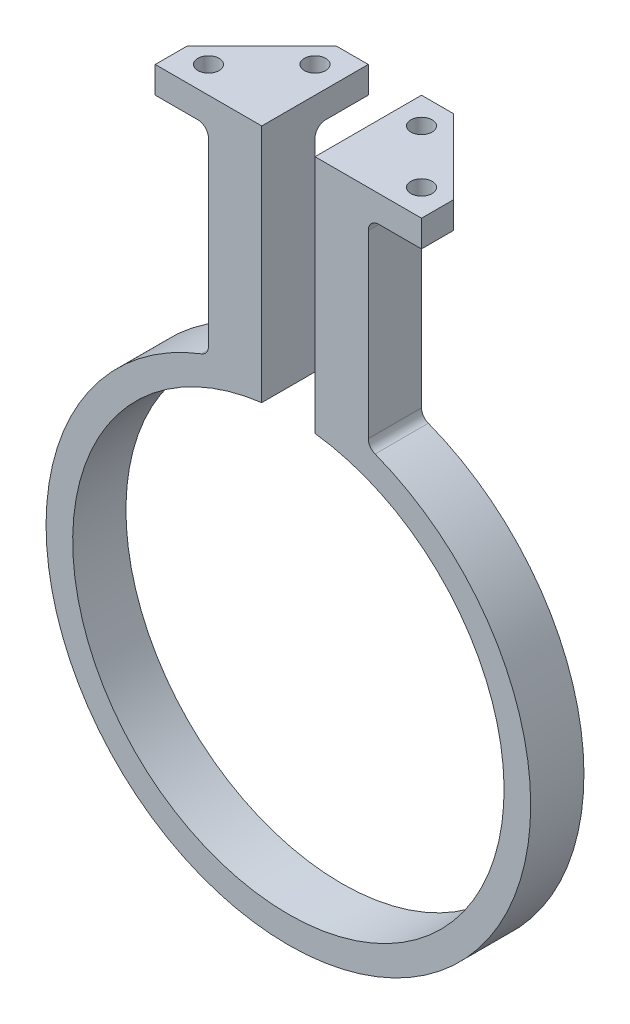
ISO-10303-21;
HEADER;
FILE_DESCRIPTION(('STEP AP214'),'2;1');
FILE_NAME('part.step','',(''),(''),'','','');
FILE_SCHEMA(('AUTOMOTIVE_DESIGN { 1 0 10303 214 1 1 1 1 }'));
ENDSEC;
DATA;
#1=APPLICATION_CONTEXT('core data for automotive mechanical design processes');
#2=APPLICATION_PROTOCOL_DEFINITION('international standard','automotive_design',2000,#1);
#3=PRODUCT_CONTEXT('',#1,'mechanical');
#4=PRODUCT('Part','Part','',(#3));
#5=PRODUCT_RELATED_PRODUCT_CATEGORY('part','',(#4));
#6=PRODUCT_DEFINITION_FORMATION('','',#4);
#7=PRODUCT_DEFINITION_CONTEXT('part definition',#1,'design');
#8=PRODUCT_DEFINITION('design','',#6,#7);
#9=PRODUCT_DEFINITION_SHAPE('','',#8);
#10=(LENGTH_UNIT() NAMED_UNIT(*) SI_UNIT(.MILLI.,.METRE.));
#11=(NAMED_UNIT(*) PLANE_ANGLE_UNIT() SI_UNIT($,.RADIAN.));
#12=(NAMED_UNIT(*) SI_UNIT($,.STERADIAN.) SOLID_ANGLE_UNIT());
#13=UNCERTAINTY_MEASURE_WITH_UNIT(LENGTH_MEASURE(1.E-05),#10,'distance_accuracy_value','');
#14=(GEOMETRIC_REPRESENTATION_CONTEXT(3) GLOBAL_UNCERTAINTY_ASSIGNED_CONTEXT((#13)) GLOBAL_UNIT_ASSIGNED_CONTEXT((#10,
#11,#12)) REPRESENTATION_CONTEXT('',''));
#15=CARTESIAN_POINT('',(0.,0.,0.));
#16=DIRECTION('',(0.,0.,1.));
#17=DIRECTION('',(1.,0.,0.));
#18=AXIS2_PLACEMENT_3D('',#15,#16,#17);
#19=CARTESIAN_POINT('',(0.,0.,12.7));
#20=DIRECTION('',(0.,0.,-1.));
#21=DIRECTION('',(-1.,0.,0.));
#22=AXIS2_PLACEMENT_3D('',#19,#20,#21);
#23=CYLINDRICAL_SURFACE('',#22,57.785);
#24=CARTESIAN_POINT('',(0.,0.,0.));
#25=DIRECTION('',(0.,0.,1.));
#26=DIRECTION('',(1.,0.,0.));
#27=AXIS2_PLACEMENT_3D('',#24,#25,#26);
#28=CIRCLE('',#27,57.785);
#29=CARTESIAN_POINT('',(-20.680947368421,53.9574336022813,0.));
#30=VERTEX_POINT('',#29);
#31=CARTESIAN_POINT('',(20.680947368421,53.9574336022813,0.));
#32=VERTEX_POINT('',#31);
#33=EDGE_CURVE('E289',#30,#32,#28,.T.);
#34=ORIENTED_EDGE('',*,*,#33,.T.);
#35=DIRECTION('',(0.,0.,-1.));
#36=VECTOR('',#35,1.);
#37=CARTESIAN_POINT('',(20.6809473684211,53.9574336022813,12.7));
#38=LINE('',#37,#36);
#39=CARTESIAN_POINT('',(20.680947368421,53.9574336022813,12.7));
#40=VERTEX_POINT('',#39);
#41=EDGE_CURVE('E404',#32,#40,#38,.F.);
#42=ORIENTED_EDGE('',*,*,#41,.T.);
#43=CARTESIAN_POINT('',(0.,0.,12.7));
#44=DIRECTION('',(0.,0.,1.));
#45=DIRECTION('',(1.,0.,0.));
#46=AXIS2_PLACEMENT_3D('',#43,#44,#45);
#47=CIRCLE('',#46,57.785);
#48=CARTESIAN_POINT('',(-20.680947368421,53.9574336022813,12.7));
#49=VERTEX_POINT('',#48);
#50=EDGE_CURVE('E290',#49,#40,#47,.T.);
#51=ORIENTED_EDGE('',*,*,#50,.F.);
#52=DIRECTION('',(0.,0.,-1.));
#53=VECTOR('',#52,1.);
#54=CARTESIAN_POINT('',(-20.6809473684211,53.9574336022813,12.7));
#55=LINE('',#54,#53);
#56=EDGE_CURVE('E400',#49,#30,#55,.T.);
#57=ORIENTED_EDGE('',*,*,#56,.T.);
#58=EDGE_LOOP('',(#34,#42,#51,#57));
#59=FACE_BOUND('',#58,.T.);
#60=ADVANCED_FACE('F41',(#59),#23,.T.);
#61=CARTESIAN_POINT('',(19.05,54.554593986208,12.7));
#62=DIRECTION('',(-1.,0.,0.));
#63=DIRECTION('',(0.,0.,1.));
#64=AXIS2_PLACEMENT_3D('',#61,#62,#63);
#65=PLANE('',#64);
#66=DIRECTION('',(0.,1.,0.));
#67=VECTOR('',#66,1.);
#68=CARTESIAN_POINT('',(19.05,54.554593986208,12.7));
#69=LINE('',#68,#67);
#70=CARTESIAN_POINT('',(19.05,56.3291889254585,12.7));
#71=VERTEX_POINT('',#70);
#72=CARTESIAN_POINT('',(19.05,99.3015196188358,12.7));
#73=VERTEX_POINT('',#72);
#74=EDGE_CURVE('E294',#71,#73,#69,.T.);
#75=ORIENTED_EDGE('',*,*,#74,.F.);
#76=DIRECTION('',(0.,0.,1.));
#77=VECTOR('',#76,1.);
#78=CARTESIAN_POINT('',(19.05,56.3291889254585,0.));
#79=LINE('',#78,#77);
#80=CARTESIAN_POINT('',(19.05,56.3291889254585,0.));
#81=VERTEX_POINT('',#80);
#82=EDGE_CURVE('E396',#71,#81,#79,.F.);
#83=ORIENTED_EDGE('',*,*,#82,.T.);
#84=DIRECTION('',(0.,1.,0.));
#85=VECTOR('',#84,1.);
#86=CARTESIAN_POINT('',(19.05,54.554593986208,0.));
#87=LINE('',#86,#85);
#88=CARTESIAN_POINT('',(19.05,99.3015196188358,0.));
#89=VERTEX_POINT('',#88);
#90=EDGE_CURVE('E315',#81,#89,#87,.T.);
#91=ORIENTED_EDGE('',*,*,#90,.T.);
#92=DIRECTION('',(0.,0.,-1.));
#93=VECTOR('',#92,1.);
#94=CARTESIAN_POINT('',(19.05,99.3015196188358,12.7));
#95=LINE('',#94,#93);
#96=EDGE_CURVE('E393',#89,#73,#95,.F.);
#97=ORIENTED_EDGE('',*,*,#96,.T.);
#98=EDGE_LOOP('',(#75,#83,#91,#97));
#99=FACE_BOUND('',#98,.T.);
#100=ADVANCED_FACE('F479',(#99),#65,.F.);
#101=CARTESIAN_POINT('',(6.35,51.0415196188358,12.7));
#102=DIRECTION('',(1.,0.,0.));
#103=DIRECTION('',(0.,0.,-1.));
#104=AXIS2_PLACEMENT_3D('',#101,#102,#103);
#105=PLANE('',#104);
#106=DIRECTION('',(0.,0.,-1.));
#107=VECTOR('',#106,1.);
#108=CARTESIAN_POINT('',(6.35,101.841519618836,-12.7));
#109=LINE('',#108,#107);
#110=CARTESIAN_POINT('',(6.35,101.841519618836,-2.54));
#111=VERTEX_POINT('',#110);
#112=CARTESIAN_POINT('',(6.35,101.841519618836,-12.7));
#113=VERTEX_POINT('',#112);
#114=EDGE_CURVE('E236',#111,#113,#109,.T.);
#115=ORIENTED_EDGE('',*,*,#114,.F.);
#116=CARTESIAN_POINT('',(6.35,99.3015196188358,-2.54));
#117=DIRECTION('',(1.,0.,0.));
#118=DIRECTION('',(0.,0.,-1.));
#119=AXIS2_PLACEMENT_3D('',#116,#117,#118);
#120=CIRCLE('',#119,2.54);
#121=CARTESIAN_POINT('',(6.35,99.3015196188358,0.));
#122=VERTEX_POINT('',#121);
#123=EDGE_CURVE('E51',#111,#122,#120,.T.);
#124=ORIENTED_EDGE('',*,*,#123,.T.);
#125=DIRECTION('',(0.,-1.,0.));
#126=VECTOR('',#125,1.);
#127=CARTESIAN_POINT('',(6.35,51.0415196188358,0.));
#128=LINE('',#127,#126);
#129=CARTESIAN_POINT('',(6.35000000000001,51.0415196188358,0.));
#130=VERTEX_POINT('',#129);
#131=EDGE_CURVE('E319',#122,#130,#128,.T.);
#132=ORIENTED_EDGE('',*,*,#131,.T.);
#133=DIRECTION('',(0.,0.,-1.));
#134=VECTOR('',#133,1.);
#135=CARTESIAN_POINT('',(6.35000000000001,51.0415196188358,12.7));
#136=LINE('',#135,#134);
#137=CARTESIAN_POINT('',(6.35000000000001,51.0415196188358,12.7));
#138=VERTEX_POINT('',#137);
#139=EDGE_CURVE('E335',#138,#130,#136,.T.);
#140=ORIENTED_EDGE('',*,*,#139,.F.);
#141=DIRECTION('',(0.,-1.,0.));
#142=VECTOR('',#141,1.);
#143=CARTESIAN_POINT('',(6.35,51.0415196188358,12.7));
#144=LINE('',#143,#142);
#145=CARTESIAN_POINT('',(6.35,108.191519618836,12.7));
#146=VERTEX_POINT('',#145);
#147=EDGE_CURVE('E222',#146,#138,#144,.T.);
#148=ORIENTED_EDGE('',*,*,#147,.F.);
#149=DIRECTION('',(0.,0.,-1.));
#150=VECTOR('',#149,1.);
#151=CARTESIAN_POINT('',(6.35,108.191519618836,-12.7));
#152=LINE('',#151,#150);
#153=CARTESIAN_POINT('',(6.35,108.191519618836,-12.7));
#154=VERTEX_POINT('',#153);
#155=EDGE_CURVE('E213',#146,#154,#152,.T.);
#156=ORIENTED_EDGE('',*,*,#155,.T.);
#157=DIRECTION('',(0.,-1.,0.));
#158=VECTOR('',#157,1.);
#159=CARTESIAN_POINT('',(6.35,108.191519618836,-12.7));
#160=LINE('',#159,#158);
#161=EDGE_CURVE('E194',#154,#113,#160,.T.);
#162=ORIENTED_EDGE('',*,*,#161,.T.);
#163=EDGE_LOOP('',(#115,#124,#132,#140,#148,#156,#162));
#164=FACE_BOUND('',#163,.T.);
#165=ADVANCED_FACE('F220',(#164),#105,.F.);
#166=CARTESIAN_POINT('',(0.,0.,12.7));
#167=DIRECTION('',(0.,0.,-1.));
#168=DIRECTION('',(-1.,0.,0.));
#169=AXIS2_PLACEMENT_3D('',#166,#167,#168);
#170=CYLINDRICAL_SURFACE('',#169,51.435);
#171=CARTESIAN_POINT('',(0.,0.,0.));
#172=DIRECTION('',(0.,0.,-1.));
#173=DIRECTION('',(1.,0.,0.));
#174=AXIS2_PLACEMENT_3D('',#171,#172,#173);
#175=CIRCLE('',#174,51.435);
#176=CARTESIAN_POINT('',(-6.35,51.0415196188358,0.));
#177=VERTEX_POINT('',#176);
#178=EDGE_CURVE('E322',#130,#177,#175,.T.);
#179=ORIENTED_EDGE('',*,*,#178,.T.);
#180=DIRECTION('',(0.,0.,-1.));
#181=VECTOR('',#180,1.);
#182=CARTESIAN_POINT('',(-6.35,51.0415196188358,12.7));
#183=LINE('',#182,#181);
#184=CARTESIAN_POINT('',(-6.35,51.0415196188358,12.7));
#185=VERTEX_POINT('',#184);
#186=EDGE_CURVE('E311',#185,#177,#183,.T.);
#187=ORIENTED_EDGE('',*,*,#186,.F.);
#188=CARTESIAN_POINT('',(0.,0.,12.7));
#189=DIRECTION('',(0.,0.,-1.));
#190=DIRECTION('',(1.,0.,0.));
#191=AXIS2_PLACEMENT_3D('',#188,#189,#190);
#192=CIRCLE('',#191,51.435);
#193=EDGE_CURVE('E301',#138,#185,#192,.T.);
#194=ORIENTED_EDGE('',*,*,#193,.F.);
#195=ORIENTED_EDGE('',*,*,#139,.T.);
#196=EDGE_LOOP('',(#179,#187,#194,#195));
#197=FACE_BOUND('',#196,.T.);
#198=ADVANCED_FACE('F499',(#197),#170,.F.);
#199=CARTESIAN_POINT('',(-6.35,51.0415196188358,12.7));
#200=DIRECTION('',(-1.,0.,0.));
#201=DIRECTION('',(0.,0.,1.));
#202=AXIS2_PLACEMENT_3D('',#199,#200,#201);
#203=PLANE('',#202);
#204=DIRECTION('',(0.,1.,0.));
#205=VECTOR('',#204,1.);
#206=CARTESIAN_POINT('',(-6.35,51.0415196188358,0.));
#207=LINE('',#206,#205);
#208=CARTESIAN_POINT('',(-6.35,99.3015196188358,0.));
#209=VERTEX_POINT('',#208);
#210=EDGE_CURVE('E325',#177,#209,#207,.T.);
#211=ORIENTED_EDGE('',*,*,#210,.T.);
#212=CARTESIAN_POINT('',(-6.35,99.3015196188358,-2.54));
#213=DIRECTION('',(-1.,0.,0.));
#214=DIRECTION('',(0.,0.,1.));
#215=AXIS2_PLACEMENT_3D('',#212,#213,#214);
#216=CIRCLE('',#215,2.54);
#217=CARTESIAN_POINT('',(-6.35,101.841519618836,-2.54));
#218=VERTEX_POINT('',#217);
#219=EDGE_CURVE('E451',#209,#218,#216,.T.);
#220=ORIENTED_EDGE('',*,*,#219,.T.);
#221=DIRECTION('',(0.,0.,-1.));
#222=VECTOR('',#221,1.);
#223=CARTESIAN_POINT('',(-6.35,101.841519618836,-12.7));
#224=LINE('',#223,#222);
#225=CARTESIAN_POINT('',(-6.35,101.841519618836,-12.7));
#226=VERTEX_POINT('',#225);
#227=EDGE_CURVE('E276',#218,#226,#224,.T.);
#228=ORIENTED_EDGE('',*,*,#227,.T.);
#229=DIRECTION('',(0.,-1.,0.));
#230=VECTOR('',#229,1.);
#231=CARTESIAN_POINT('',(-6.35,108.191519618836,-12.7));
#232=LINE('',#231,#230);
#233=CARTESIAN_POINT('',(-6.35,108.191519618836,-12.7));
#234=VERTEX_POINT('',#233);
#235=EDGE_CURVE('E269',#234,#226,#232,.T.);
#236=ORIENTED_EDGE('',*,*,#235,.F.);
#237=DIRECTION('',(0.,0.,-1.));
#238=VECTOR('',#237,1.);
#239=CARTESIAN_POINT('',(-6.35,108.191519618836,-12.7));
#240=LINE('',#239,#238);
#241=CARTESIAN_POINT('',(-6.35,108.191519618836,12.7));
#242=VERTEX_POINT('',#241);
#243=EDGE_CURVE('E262',#242,#234,#240,.T.);
#244=ORIENTED_EDGE('',*,*,#243,.F.);
#245=DIRECTION('',(0.,1.,0.));
#246=VECTOR('',#245,1.);
#247=CARTESIAN_POINT('',(-6.35,51.0415196188358,12.7));
#248=LINE('',#247,#246);
#249=EDGE_CURVE('E304',#185,#242,#248,.T.);
#250=ORIENTED_EDGE('',*,*,#249,.F.);
#251=ORIENTED_EDGE('',*,*,#186,.T.);
#252=EDGE_LOOP('',(#211,#220,#228,#236,#244,#250,#251));
#253=FACE_BOUND('',#252,.T.);
#254=ADVANCED_FACE('F688',(#253),#203,.F.);
#255=CARTESIAN_POINT('',(-19.05,54.554593986208,12.7));
#256=DIRECTION('',(1.,0.,0.));
#257=DIRECTION('',(0.,0.,-1.));
#258=AXIS2_PLACEMENT_3D('',#255,#256,#257);
#259=PLANE('',#258);
#260=DIRECTION('',(0.,-1.,0.));
#261=VECTOR('',#260,1.);
#262=CARTESIAN_POINT('',(-19.05,54.554593986208,0.));
#263=LINE('',#262,#261);
#264=CARTESIAN_POINT('',(-19.05,99.3015196188358,0.));
#265=VERTEX_POINT('',#264);
#266=CARTESIAN_POINT('',(-19.05,56.3291889254585,0.));
#267=VERTEX_POINT('',#266);
#268=EDGE_CURVE('E295',#265,#267,#263,.T.);
#269=ORIENTED_EDGE('',*,*,#268,.T.);
#270=DIRECTION('',(0.,0.,1.));
#271=VECTOR('',#270,1.);
#272=CARTESIAN_POINT('',(-19.05,56.3291889254585,12.7));
#273=LINE('',#272,#271);
#274=CARTESIAN_POINT('',(-19.05,56.3291889254585,12.7));
#275=VERTEX_POINT('',#274);
#276=EDGE_CURVE('E411',#267,#275,#273,.T.);
#277=ORIENTED_EDGE('',*,*,#276,.T.);
#278=DIRECTION('',(0.,-1.,0.));
#279=VECTOR('',#278,1.);
#280=CARTESIAN_POINT('',(-19.05,54.554593986208,12.7));
#281=LINE('',#280,#279);
#282=CARTESIAN_POINT('',(-19.05,99.3015196188358,12.7));
#283=VERTEX_POINT('',#282);
#284=EDGE_CURVE('E307',#283,#275,#281,.T.);
#285=ORIENTED_EDGE('',*,*,#284,.F.);
#286=DIRECTION('',(0.,0.,-1.));
#287=VECTOR('',#286,1.);
#288=CARTESIAN_POINT('',(-19.05,99.3015196188358,0.));
#289=LINE('',#288,#287);
#290=EDGE_CURVE('E407',#283,#265,#289,.T.);
#291=ORIENTED_EDGE('',*,*,#290,.T.);
#292=EDGE_LOOP('',(#269,#277,#285,#291));
#293=FACE_BOUND('',#292,.T.);
#294=ADVANCED_FACE('F702',(#293),#259,.F.);
#295=CARTESIAN_POINT('',(0.,0.,12.7));
#296=DIRECTION('',(0.,0.,1.));
#297=DIRECTION('',(1.,0.,0.));
#298=AXIS2_PLACEMENT_3D('',#295,#296,#297);
#299=PLANE('',#298);
#300=ORIENTED_EDGE('',*,*,#284,.T.);
#301=CARTESIAN_POINT('',(-21.59,56.3291889254585,12.7));
#302=DIRECTION('',(0.,0.,1.));
#303=DIRECTION('',(1.,0.,0.));
#304=AXIS2_PLACEMENT_3D('',#301,#302,#303);
#305=CIRCLE('',#304,2.54);
#306=EDGE_CURVE('E445',#275,#49,#305,.F.);
#307=ORIENTED_EDGE('',*,*,#306,.T.);
#308=ORIENTED_EDGE('',*,*,#50,.T.);
#309=CARTESIAN_POINT('',(21.59,56.3291889254585,12.7));
#310=DIRECTION('',(0.,0.,1.));
#311=DIRECTION('',(1.,0.,0.));
#312=AXIS2_PLACEMENT_3D('',#309,#310,#311);
#313=CIRCLE('',#312,2.54);
#314=EDGE_CURVE('E439',#40,#71,#313,.F.);
#315=ORIENTED_EDGE('',*,*,#314,.T.);
#316=ORIENTED_EDGE('',*,*,#74,.T.);
#317=CARTESIAN_POINT('',(21.59,99.3015196188358,12.7));
#318=DIRECTION('',(0.,0.,1.));
#319=DIRECTION('',(1.,0.,0.));
#320=AXIS2_PLACEMENT_3D('',#317,#318,#319);
#321=CIRCLE('',#320,2.54);
#322=CARTESIAN_POINT('',(21.59,101.841519618836,12.7));
#323=VERTEX_POINT('',#322);
#324=EDGE_CURVE('E11',#73,#323,#321,.F.);
#325=ORIENTED_EDGE('',*,*,#324,.T.);
#326=DIRECTION('',(-1.,0.,0.));
#327=VECTOR('',#326,1.);
#328=CARTESIAN_POINT('',(31.75,101.841519618836,12.7));
#329=LINE('',#328,#327);
#330=CARTESIAN_POINT('',(31.75,101.841519618836,12.7));
#331=VERTEX_POINT('',#330);
#332=EDGE_CURVE('E239',#331,#323,#329,.T.);
#333=ORIENTED_EDGE('',*,*,#332,.F.);
#334=DIRECTION('',(0.,-1.,0.));
#335=VECTOR('',#334,1.);
#336=CARTESIAN_POINT('',(31.75,108.191519618836,12.7));
#337=LINE('',#336,#335);
#338=CARTESIAN_POINT('',(31.75,108.191519618836,12.7));
#339=VERTEX_POINT('',#338);
#340=EDGE_CURVE('E206',#339,#331,#337,.T.);
#341=ORIENTED_EDGE('',*,*,#340,.F.);
#342=DIRECTION('',(-1.,0.,0.));
#343=VECTOR('',#342,1.);
#344=CARTESIAN_POINT('',(31.75,108.191519618836,12.7));
#345=LINE('',#344,#343);
#346=EDGE_CURVE('E224',#339,#146,#345,.T.);
#347=ORIENTED_EDGE('',*,*,#346,.T.);
#348=ORIENTED_EDGE('',*,*,#147,.T.);
#349=ORIENTED_EDGE('',*,*,#193,.T.);
#350=ORIENTED_EDGE('',*,*,#249,.T.);
#351=DIRECTION('',(1.,0.,0.));
#352=VECTOR('',#351,1.);
#353=CARTESIAN_POINT('',(-31.75,108.191519618836,12.7));
#354=LINE('',#353,#352);
#355=CARTESIAN_POINT('',(-31.75,108.191519618836,12.7));
#356=VERTEX_POINT('',#355);
#357=EDGE_CURVE('E257',#356,#242,#354,.T.);
#358=ORIENTED_EDGE('',*,*,#357,.F.);
#359=DIRECTION('',(0.,-1.,0.));
#360=VECTOR('',#359,1.);
#361=CARTESIAN_POINT('',(-31.75,108.191519618836,12.7));
#362=LINE('',#361,#360);
#363=CARTESIAN_POINT('',(-31.75,101.841519618836,12.7));
#364=VERTEX_POINT('',#363);
#365=EDGE_CURVE('E285',#356,#364,#362,.T.);
#366=ORIENTED_EDGE('',*,*,#365,.T.);
#367=DIRECTION('',(1.,0.,0.));
#368=VECTOR('',#367,1.);
#369=CARTESIAN_POINT('',(-31.75,101.841519618836,12.7));
#370=LINE('',#369,#368);
#371=CARTESIAN_POINT('',(-21.59,101.841519618836,12.7));
#372=VERTEX_POINT('',#371);
#373=EDGE_CURVE('E272',#364,#372,#370,.T.);
#374=ORIENTED_EDGE('',*,*,#373,.T.);
#375=CARTESIAN_POINT('',(-21.59,99.3015196188358,12.7));
#376=DIRECTION('',(0.,0.,1.));
#377=DIRECTION('',(1.,0.,0.));
#378=AXIS2_PLACEMENT_3D('',#375,#376,#377);
#379=CIRCLE('',#378,2.54);
#380=EDGE_CURVE('E448',#372,#283,#379,.F.);
#381=ORIENTED_EDGE('',*,*,#380,.T.);
#382=EDGE_LOOP('',(#300,#307,#308,#315,#316,#325,#333,#341,#347,#348,#349,#350,#358,#366,#374,#381));
#383=FACE_BOUND('',#382,.T.);
#384=ADVANCED_FACE('F483',(#383),#299,.T.);
#385=CARTESIAN_POINT('',(0.,0.,0.));
#386=DIRECTION('',(0.,0.,1.));
#387=DIRECTION('',(1.,0.,0.));
#388=AXIS2_PLACEMENT_3D('',#385,#386,#387);
#389=PLANE('',#388);
#390=ORIENTED_EDGE('',*,*,#268,.F.);
#391=DIRECTION('',(-1.,0.,0.));
#392=VECTOR('',#391,1.);
#393=CARTESIAN_POINT('',(-6.35,99.3015196188358,0.));
#394=LINE('',#393,#392);
#395=EDGE_CURVE('E423',#265,#209,#394,.F.);
#396=ORIENTED_EDGE('',*,*,#395,.T.);
#397=ORIENTED_EDGE('',*,*,#210,.F.);
#398=ORIENTED_EDGE('',*,*,#178,.F.);
#399=ORIENTED_EDGE('',*,*,#131,.F.);
#400=DIRECTION('',(-1.,0.,0.));
#401=VECTOR('',#400,1.);
#402=CARTESIAN_POINT('',(19.05,99.3015196188358,0.));
#403=LINE('',#402,#401);
#404=EDGE_CURVE('E420',#122,#89,#403,.F.);
#405=ORIENTED_EDGE('',*,*,#404,.T.);
#406=ORIENTED_EDGE('',*,*,#90,.F.);
#407=CARTESIAN_POINT('',(21.59,56.3291889254585,0.));
#408=DIRECTION('',(0.,0.,1.));
#409=DIRECTION('',(1.,0.,0.));
#410=AXIS2_PLACEMENT_3D('',#407,#408,#409);
#411=CIRCLE('',#410,2.54);
#412=EDGE_CURVE('E436',#81,#32,#411,.T.);
#413=ORIENTED_EDGE('',*,*,#412,.T.);
#414=ORIENTED_EDGE('',*,*,#33,.F.);
#415=CARTESIAN_POINT('',(-21.59,56.3291889254585,0.));
#416=DIRECTION('',(0.,0.,1.));
#417=DIRECTION('',(1.,0.,0.));
#418=AXIS2_PLACEMENT_3D('',#415,#416,#417);
#419=CIRCLE('',#418,2.54);
#420=EDGE_CURVE('E442',#30,#267,#419,.T.);
#421=ORIENTED_EDGE('',*,*,#420,.T.);
#422=EDGE_LOOP('',(#390,#396,#397,#398,#399,#405,#406,#413,#414,#421));
#423=FACE_BOUND('',#422,.T.);
#424=ADVANCED_FACE('F492',(#423),#389,.F.);
#425=CARTESIAN_POINT('',(0.,101.841519618836,0.));
#426=DIRECTION('',(0.,1.,0.));
#427=DIRECTION('',(0.,0.,1.));
#428=AXIS2_PLACEMENT_3D('',#425,#426,#427);
#429=PLANE('',#428);
#430=CARTESIAN_POINT('',(-12.7,101.841519618836,-6.35));
#431=DIRECTION('',(0.,1.,0.));
#432=DIRECTION('',(0.,0.,1.));
#433=AXIS2_PLACEMENT_3D('',#430,#431,#432);
#434=CIRCLE('',#433,3.64399415702657);
#435=CARTESIAN_POINT('',(-12.7,101.841519618836,-9.99399415702658));
#436=VERTEX_POINT('',#435);
#437=EDGE_CURVE('E343',#436,#436,#434,.T.);
#438=ORIENTED_EDGE('',*,*,#437,.T.);
#439=EDGE_LOOP('',(#438));
#440=FACE_BOUND('',#439,.T.);
#441=CARTESIAN_POINT('',(-25.4,101.841519618836,6.35));
#442=DIRECTION('',(0.,1.,0.));
#443=DIRECTION('',(0.,0.,1.));
#444=AXIS2_PLACEMENT_3D('',#441,#442,#443);
#445=CIRCLE('',#444,3.64399415702654);
#446=CARTESIAN_POINT('',(-25.4,101.841519618836,9.99399415702654));
#447=VERTEX_POINT('',#446);
#448=EDGE_CURVE('E339',#447,#447,#445,.T.);
#449=ORIENTED_EDGE('',*,*,#448,.T.);
#450=EDGE_LOOP('',(#449));
#451=FACE_BOUND('',#450,.T.);
#452=DIRECTION('',(-1.,0.,0.));
#453=VECTOR('',#452,1.);
#454=CARTESIAN_POINT('',(-19.05,101.841519618836,-2.54));
#455=LINE('',#454,#453);
#456=CARTESIAN_POINT('',(-21.59,101.841519618836,-2.54));
#457=VERTEX_POINT('',#456);
#458=EDGE_CURVE('E414',#218,#457,#455,.T.);
#459=ORIENTED_EDGE('',*,*,#458,.T.);
#460=DIRECTION('',(0.,0.,-1.));
#461=VECTOR('',#460,1.);
#462=CARTESIAN_POINT('',(-21.59,101.841519618836,12.7));
#463=LINE('',#462,#461);
#464=EDGE_CURVE('E417',#457,#372,#463,.F.);
#465=ORIENTED_EDGE('',*,*,#464,.T.);
#466=ORIENTED_EDGE('',*,*,#373,.F.);
#467=DIRECTION('',(0.,0.,1.));
#468=VECTOR('',#467,1.);
#469=CARTESIAN_POINT('',(-31.75,101.841519618836,-12.7));
#470=LINE('',#469,#468);
#471=CARTESIAN_POINT('',(-31.75,101.841519618836,5.07999999999996));
#472=VERTEX_POINT('',#471);
#473=EDGE_CURVE('E253',#472,#364,#470,.T.);
#474=ORIENTED_EDGE('',*,*,#473,.F.);
#475=DIRECTION('',(-0.707106781186549,0.,0.707106781186546));
#476=VECTOR('',#475,1.);
#477=CARTESIAN_POINT('',(-31.75,101.841519618836,5.07999999999996));
#478=LINE('',#477,#476);
#479=CARTESIAN_POINT('',(-13.97,101.841519618836,-12.7));
#480=VERTEX_POINT('',#479);
#481=EDGE_CURVE('E384',#472,#480,#478,.F.);
#482=ORIENTED_EDGE('',*,*,#481,.T.);
#483=DIRECTION('',(-1.,0.,0.));
#484=VECTOR('',#483,1.);
#485=CARTESIAN_POINT('',(-31.75,101.841519618836,-12.7));
#486=LINE('',#485,#484);
#487=EDGE_CURVE('E258',#226,#480,#486,.T.);
#488=ORIENTED_EDGE('',*,*,#487,.F.);
#489=ORIENTED_EDGE('',*,*,#227,.F.);
#490=EDGE_LOOP('',(#459,#465,#466,#474,#482,#488,#489));
#491=FACE_BOUND('',#490,.T.);
#492=ADVANCED_FACE('F723',(#440,#451,#491),#429,.F.);
#493=CARTESIAN_POINT('',(0.,108.191519618836,0.));
#494=DIRECTION('',(0.,1.,0.));
#495=DIRECTION('',(0.,0.,1.));
#496=AXIS2_PLACEMENT_3D('',#493,#494,#495);
#497=PLANE('',#496);
#498=CARTESIAN_POINT('',(-12.7,108.191519618836,-6.35));
#499=DIRECTION('',(0.,1.,0.));
#500=DIRECTION('',(0.,0.,1.));
#501=AXIS2_PLACEMENT_3D('',#498,#499,#500);
#502=CIRCLE('',#501,2.54);
#503=CARTESIAN_POINT('',(-12.7,108.191519618836,-3.81));
#504=VERTEX_POINT('',#503);
#505=EDGE_CURVE('E249',#504,#504,#502,.T.);
#506=ORIENTED_EDGE('',*,*,#505,.F.);
#507=EDGE_LOOP('',(#506));
#508=FACE_BOUND('',#507,.T.);
#509=DIRECTION('',(-1.,0.,0.));
#510=VECTOR('',#509,1.);
#511=CARTESIAN_POINT('',(-31.75,108.191519618836,-12.7));
#512=LINE('',#511,#510);
#513=CARTESIAN_POINT('',(-13.97,108.191519618836,-12.7));
#514=VERTEX_POINT('',#513);
#515=EDGE_CURVE('E265',#234,#514,#512,.T.);
#516=ORIENTED_EDGE('',*,*,#515,.T.);
#517=DIRECTION('',(0.707106781186549,0.,-0.707106781186546));
#518=VECTOR('',#517,1.);
#519=CARTESIAN_POINT('',(-13.335,108.191519618836,-13.335));
#520=LINE('',#519,#518);
#521=CARTESIAN_POINT('',(-31.75,108.191519618836,5.07999999999996));
#522=VERTEX_POINT('',#521);
#523=EDGE_CURVE('E390',#514,#522,#520,.F.);
#524=ORIENTED_EDGE('',*,*,#523,.T.);
#525=DIRECTION('',(0.,0.,1.));
#526=VECTOR('',#525,1.);
#527=CARTESIAN_POINT('',(-31.75,108.191519618836,-12.7));
#528=LINE('',#527,#526);
#529=EDGE_CURVE('E254',#522,#356,#528,.T.);
#530=ORIENTED_EDGE('',*,*,#529,.T.);
#531=ORIENTED_EDGE('',*,*,#357,.T.);
#532=ORIENTED_EDGE('',*,*,#243,.T.);
#533=EDGE_LOOP('',(#516,#524,#530,#531,#532));
#534=FACE_BOUND('',#533,.T.);
#535=CARTESIAN_POINT('',(-25.4,108.191519618836,6.35));
#536=DIRECTION('',(0.,1.,0.));
#537=DIRECTION('',(0.,0.,1.));
#538=AXIS2_PLACEMENT_3D('',#535,#536,#537);
#539=CIRCLE('',#538,2.54);
#540=CARTESIAN_POINT('',(-25.4,108.191519618836,8.89));
#541=VERTEX_POINT('',#540);
#542=EDGE_CURVE('E205',#541,#541,#539,.T.);
#543=ORIENTED_EDGE('',*,*,#542,.F.);
#544=EDGE_LOOP('',(#543));
#545=FACE_BOUND('',#544,.T.);
#546=ADVANCED_FACE('F730',(#508,#534,#545),#497,.T.);
#547=CARTESIAN_POINT('',(-31.75,108.191519618836,-12.7));
#548=DIRECTION('',(1.,0.,0.));
#549=DIRECTION('',(0.,0.,-1.));
#550=AXIS2_PLACEMENT_3D('',#547,#548,#549);
#551=PLANE('',#550);
#552=ORIENTED_EDGE('',*,*,#529,.F.);
#553=DIRECTION('',(0.,-1.,0.));
#554=VECTOR('',#553,1.);
#555=CARTESIAN_POINT('',(-31.75,108.191519618836,5.07999999999996));
#556=LINE('',#555,#554);
#557=EDGE_CURVE('E380',#522,#472,#556,.T.);
#558=ORIENTED_EDGE('',*,*,#557,.T.);
#559=ORIENTED_EDGE('',*,*,#473,.T.);
#560=ORIENTED_EDGE('',*,*,#365,.F.);
#561=EDGE_LOOP('',(#552,#558,#559,#560));
#562=FACE_BOUND('',#561,.T.);
#563=ADVANCED_FACE('F737',(#562),#551,.F.);
#564=CARTESIAN_POINT('',(-31.75,108.191519618836,-12.7));
#565=DIRECTION('',(0.,0.,1.));
#566=DIRECTION('',(1.,0.,0.));
#567=AXIS2_PLACEMENT_3D('',#564,#565,#566);
#568=PLANE('',#567);
#569=ORIENTED_EDGE('',*,*,#487,.T.);
#570=DIRECTION('',(0.,1.,0.));
#571=VECTOR('',#570,1.);
#572=CARTESIAN_POINT('',(-13.97,108.191519618836,-12.7));
#573=LINE('',#572,#571);
#574=EDGE_CURVE('E387',#480,#514,#573,.T.);
#575=ORIENTED_EDGE('',*,*,#574,.T.);
#576=ORIENTED_EDGE('',*,*,#515,.F.);
#577=ORIENTED_EDGE('',*,*,#235,.T.);
#578=EDGE_LOOP('',(#569,#575,#576,#577));
#579=FACE_BOUND('',#578,.T.);
#580=ADVANCED_FACE('F677',(#579),#568,.F.);
#581=CARTESIAN_POINT('',(-12.7,108.191519618836,-6.35));
#582=DIRECTION('',(0.,-1.,0.));
#583=DIRECTION('',(0.,0.,-1.));
#584=AXIS2_PLACEMENT_3D('',#581,#582,#583);
#585=CYLINDRICAL_SURFACE('',#584,2.54);
#586=CARTESIAN_POINT('',(-12.7,103.111519618836,-6.35));
#587=DIRECTION('',(0.,1.,0.));
#588=DIRECTION('',(0.,0.,1.));
#589=AXIS2_PLACEMENT_3D('',#586,#587,#588);
#590=CIRCLE('',#589,2.54);
#591=CARTESIAN_POINT('',(-12.7,103.111519618836,-8.89000000000001));
#592=VERTEX_POINT('',#591);
#593=EDGE_CURVE('E347',#592,#592,#590,.F.);
#594=ORIENTED_EDGE('',*,*,#593,.T.);
#595=EDGE_LOOP('',(#594));
#596=FACE_BOUND('',#595,.T.);
#597=ORIENTED_EDGE('',*,*,#505,.T.);
#598=EDGE_LOOP('',(#597));
#599=FACE_BOUND('',#598,.T.);
#600=ADVANCED_FACE('F665',(#596,#599),#585,.F.);
#601=CARTESIAN_POINT('',(-25.4,108.191519618836,6.35));
#602=DIRECTION('',(0.,-1.,0.));
#603=DIRECTION('',(0.,0.,-1.));
#604=AXIS2_PLACEMENT_3D('',#601,#602,#603);
#605=CYLINDRICAL_SURFACE('',#604,2.54);
#606=CARTESIAN_POINT('',(-25.4,103.111519618836,6.35));
#607=DIRECTION('',(0.,1.,0.));
#608=DIRECTION('',(0.,0.,1.));
#609=AXIS2_PLACEMENT_3D('',#606,#607,#608);
#610=CIRCLE('',#609,2.54);
#611=CARTESIAN_POINT('',(-25.4,103.111519618836,8.89));
#612=VERTEX_POINT('',#611);
#613=EDGE_CURVE('E361',#612,#612,#610,.F.);
#614=ORIENTED_EDGE('',*,*,#613,.T.);
#615=EDGE_LOOP('',(#614));
#616=FACE_BOUND('',#615,.T.);
#617=ORIENTED_EDGE('',*,*,#542,.T.);
#618=EDGE_LOOP('',(#617));
#619=FACE_BOUND('',#618,.T.);
#620=ADVANCED_FACE('F660',(#616,#619),#605,.F.);
#621=CARTESIAN_POINT('',(0.,101.841519618836,0.));
#622=DIRECTION('',(0.,1.,0.));
#623=DIRECTION('',(0.,0.,1.));
#624=AXIS2_PLACEMENT_3D('',#621,#622,#623);
#625=PLANE('',#624);
#626=CARTESIAN_POINT('',(12.7,101.841519618836,-6.35));
#627=DIRECTION('',(0.,1.,0.));
#628=DIRECTION('',(0.,0.,1.));
#629=AXIS2_PLACEMENT_3D('',#626,#627,#628);
#630=CIRCLE('',#629,3.81000000000001);
#631=CARTESIAN_POINT('',(12.7,101.841519618836,-2.54));
#632=VERTEX_POINT('',#631);
#633=EDGE_CURVE('E358',#632,#632,#630,.T.);
#634=ORIENTED_EDGE('',*,*,#633,.T.);
#635=DIRECTION('',(-1.,0.,0.));
#636=VECTOR('',#635,1.);
#637=CARTESIAN_POINT('',(6.35,101.841519618836,-2.54));
#638=LINE('',#637,#636);
#639=EDGE_CURVE('E66',#632,#111,#638,.T.);
#640=ORIENTED_EDGE('',*,*,#639,.T.);
#641=ORIENTED_EDGE('',*,*,#114,.T.);
#642=DIRECTION('',(1.,0.,0.));
#643=VECTOR('',#642,1.);
#644=CARTESIAN_POINT('',(31.75,101.841519618836,-12.7));
#645=LINE('',#644,#643);
#646=CARTESIAN_POINT('',(13.97,101.841519618836,-12.7));
#647=VERTEX_POINT('',#646);
#648=EDGE_CURVE('E201',#113,#647,#645,.T.);
#649=ORIENTED_EDGE('',*,*,#648,.T.);
#650=DIRECTION('',(-0.707106781186546,0.,-0.707106781186549));
#651=VECTOR('',#650,1.);
#652=CARTESIAN_POINT('',(13.97,101.841519618836,-12.7));
#653=LINE('',#652,#651);
#654=CARTESIAN_POINT('',(31.75,101.841519618836,5.08000000000002));
#655=VERTEX_POINT('',#654);
#656=EDGE_CURVE('E372',#647,#655,#653,.F.);
#657=ORIENTED_EDGE('',*,*,#656,.T.);
#658=DIRECTION('',(0.,0.,1.));
#659=VECTOR('',#658,1.);
#660=CARTESIAN_POINT('',(31.75,101.841519618836,-12.7));
#661=LINE('',#660,#659);
#662=EDGE_CURVE('E230',#655,#331,#661,.T.);
#663=ORIENTED_EDGE('',*,*,#662,.T.);
#664=ORIENTED_EDGE('',*,*,#332,.T.);
#665=DIRECTION('',(0.,0.,-1.));
#666=VECTOR('',#665,1.);
#667=CARTESIAN_POINT('',(21.59,101.841519618836,0.));
#668=LINE('',#667,#666);
#669=CARTESIAN_POINT('',(21.59,101.841519618836,6.35));
#670=VERTEX_POINT('',#669);
#671=EDGE_CURVE('E428',#323,#670,#668,.T.);
#672=ORIENTED_EDGE('',*,*,#671,.T.);
#673=CARTESIAN_POINT('',(25.4,101.841519618836,6.35));
#674=DIRECTION('',(0.,1.,0.));
#675=DIRECTION('',(0.,0.,1.));
#676=AXIS2_PLACEMENT_3D('',#673,#674,#675);
#677=CIRCLE('',#676,3.81000000000001);
#678=EDGE_CURVE('E355',#670,#670,#677,.T.);
#679=ORIENTED_EDGE('',*,*,#678,.T.);
#680=DIRECTION('',(0.,0.,-1.));
#681=VECTOR('',#680,1.);
#682=CARTESIAN_POINT('',(21.59,101.841519618836,0.));
#683=LINE('',#682,#681);
#684=CARTESIAN_POINT('',(21.59,101.841519618836,-2.54));
#685=VERTEX_POINT('',#684);
#686=EDGE_CURVE('E59',#670,#685,#683,.T.);
#687=ORIENTED_EDGE('',*,*,#686,.T.);
#688=DIRECTION('',(-1.,0.,0.));
#689=VECTOR('',#688,1.);
#690=CARTESIAN_POINT('',(6.35,101.841519618836,-2.54));
#691=LINE('',#690,#689);
#692=EDGE_CURVE('E431',#685,#632,#691,.T.);
#693=ORIENTED_EDGE('',*,*,#692,.T.);
#694=EDGE_LOOP('',(#634,#640,#641,#649,#657,#663,#664,#672,#679,#687,#693));
#695=FACE_BOUND('',#694,.T.);
#696=ADVANCED_FACE('F509',(#695),#625,.F.);
#697=CARTESIAN_POINT('',(31.75,108.191519618836,-12.7));
#698=DIRECTION('',(1.,0.,0.));
#699=DIRECTION('',(0.,0.,-1.));
#700=AXIS2_PLACEMENT_3D('',#697,#698,#699);
#701=PLANE('',#700);
#702=ORIENTED_EDGE('',*,*,#662,.F.);
#703=DIRECTION('',(0.,1.,0.));
#704=VECTOR('',#703,1.);
#705=CARTESIAN_POINT('',(31.75,108.191519618836,5.08000000000002));
#706=LINE('',#705,#704);
#707=CARTESIAN_POINT('',(31.75,108.191519618836,5.08000000000002));
#708=VERTEX_POINT('',#707);
#709=EDGE_CURVE('E375',#655,#708,#706,.T.);
#710=ORIENTED_EDGE('',*,*,#709,.T.);
#711=DIRECTION('',(0.,0.,1.));
#712=VECTOR('',#711,1.);
#713=CARTESIAN_POINT('',(31.75,108.191519618836,-12.7));
#714=LINE('',#713,#712);
#715=EDGE_CURVE('E218',#708,#339,#714,.T.);
#716=ORIENTED_EDGE('',*,*,#715,.T.);
#717=ORIENTED_EDGE('',*,*,#340,.T.);
#718=EDGE_LOOP('',(#702,#710,#716,#717));
#719=FACE_BOUND('',#718,.T.);
#720=ADVANCED_FACE('F537',(#719),#701,.T.);
#721=CARTESIAN_POINT('',(31.75,108.191519618836,-12.7));
#722=DIRECTION('',(0.,0.,-1.));
#723=DIRECTION('',(-1.,0.,0.));
#724=AXIS2_PLACEMENT_3D('',#721,#722,#723);
#725=PLANE('',#724);
#726=DIRECTION('',(1.,0.,0.));
#727=VECTOR('',#726,1.);
#728=CARTESIAN_POINT('',(31.75,108.191519618836,-12.7));
#729=LINE('',#728,#727);
#730=CARTESIAN_POINT('',(13.97,108.191519618836,-12.7));
#731=VERTEX_POINT('',#730);
#732=EDGE_CURVE('E198',#154,#731,#729,.T.);
#733=ORIENTED_EDGE('',*,*,#732,.T.);
#734=DIRECTION('',(0.,-1.,0.));
#735=VECTOR('',#734,1.);
#736=CARTESIAN_POINT('',(13.97,108.191519618836,-12.7));
#737=LINE('',#736,#735);
#738=EDGE_CURVE('E369',#731,#647,#737,.T.);
#739=ORIENTED_EDGE('',*,*,#738,.T.);
#740=ORIENTED_EDGE('',*,*,#648,.F.);
#741=ORIENTED_EDGE('',*,*,#161,.F.);
#742=EDGE_LOOP('',(#733,#739,#740,#741));
#743=FACE_BOUND('',#742,.T.);
#744=ADVANCED_FACE('F196',(#743),#725,.T.);
#745=CARTESIAN_POINT('',(0.,108.191519618836,0.));
#746=DIRECTION('',(0.,1.,0.));
#747=DIRECTION('',(0.,0.,1.));
#748=AXIS2_PLACEMENT_3D('',#745,#746,#747);
#749=PLANE('',#748);
#750=CARTESIAN_POINT('',(25.4,108.191519618836,6.35));
#751=DIRECTION('',(0.,-1.,0.));
#752=DIRECTION('',(0.,0.,1.));
#753=AXIS2_PLACEMENT_3D('',#750,#751,#752);
#754=CIRCLE('',#753,2.54);
#755=CARTESIAN_POINT('',(25.4,108.191519618836,8.89));
#756=VERTEX_POINT('',#755);
#757=EDGE_CURVE('E457',#756,#756,#754,.T.);
#758=ORIENTED_EDGE('',*,*,#757,.T.);
#759=EDGE_LOOP('',(#758));
#760=FACE_BOUND('',#759,.T.);
#761=CARTESIAN_POINT('',(12.7,108.191519618836,-6.35));
#762=DIRECTION('',(0.,-1.,0.));
#763=DIRECTION('',(0.,0.,1.));
#764=AXIS2_PLACEMENT_3D('',#761,#762,#763);
#765=CIRCLE('',#764,2.54);
#766=CARTESIAN_POINT('',(12.7,108.191519618836,-3.81));
#767=VERTEX_POINT('',#766);
#768=EDGE_CURVE('E233',#767,#767,#765,.T.);
#769=ORIENTED_EDGE('',*,*,#768,.T.);
#770=EDGE_LOOP('',(#769));
#771=FACE_BOUND('',#770,.T.);
#772=ORIENTED_EDGE('',*,*,#715,.F.);
#773=DIRECTION('',(0.707106781186546,0.,0.707106781186549));
#774=VECTOR('',#773,1.);
#775=CARTESIAN_POINT('',(13.335,108.191519618836,-13.335));
#776=LINE('',#775,#774);
#777=EDGE_CURVE('E216',#708,#731,#776,.F.);
#778=ORIENTED_EDGE('',*,*,#777,.T.);
#779=ORIENTED_EDGE('',*,*,#732,.F.);
#780=ORIENTED_EDGE('',*,*,#155,.F.);
#781=ORIENTED_EDGE('',*,*,#346,.F.);
#782=EDGE_LOOP('',(#772,#778,#779,#780,#781));
#783=FACE_BOUND('',#782,.T.);
#784=ADVANCED_FACE('F211',(#760,#771,#783),#749,.T.);
#785=CARTESIAN_POINT('',(12.7,108.191519618836,-6.35));
#786=DIRECTION('',(0.,-1.,0.));
#787=DIRECTION('',(0.,0.,-1.));
#788=AXIS2_PLACEMENT_3D('',#785,#786,#787);
#789=CYLINDRICAL_SURFACE('',#788,2.54);
#790=CARTESIAN_POINT('',(12.7,102.945513775862,-6.35));
#791=DIRECTION('',(0.,1.,0.));
#792=DIRECTION('',(0.,0.,1.));
#793=AXIS2_PLACEMENT_3D('',#790,#791,#792);
#794=CIRCLE('',#793,2.54);
#795=CARTESIAN_POINT('',(12.7,102.945513775862,-3.81));
#796=VERTEX_POINT('',#795);
#797=EDGE_CURVE('E351',#796,#796,#794,.F.);
#798=ORIENTED_EDGE('',*,*,#797,.T.);
#799=EDGE_LOOP('',(#798));
#800=FACE_BOUND('',#799,.T.);
#801=ORIENTED_EDGE('',*,*,#768,.F.);
#802=EDGE_LOOP('',(#801));
#803=FACE_BOUND('',#802,.T.);
#804=ADVANCED_FACE('F521',(#800,#803),#789,.F.);
#805=CARTESIAN_POINT('',(25.4,108.191519618836,6.35));
#806=DIRECTION('',(0.,-1.,0.));
#807=DIRECTION('',(0.,0.,-1.));
#808=AXIS2_PLACEMENT_3D('',#805,#806,#807);
#809=CYLINDRICAL_SURFACE('',#808,2.54);
#810=CARTESIAN_POINT('',(25.4,102.945513775862,6.35));
#811=DIRECTION('',(0.,1.,0.));
#812=DIRECTION('',(0.,0.,1.));
#813=AXIS2_PLACEMENT_3D('',#810,#811,#812);
#814=CIRCLE('',#813,2.54);
#815=CARTESIAN_POINT('',(25.4,102.945513775862,8.89));
#816=VERTEX_POINT('',#815);
#817=EDGE_CURVE('E365',#816,#816,#814,.F.);
#818=ORIENTED_EDGE('',*,*,#817,.T.);
#819=EDGE_LOOP('',(#818));
#820=FACE_BOUND('',#819,.T.);
#821=ORIENTED_EDGE('',*,*,#757,.F.);
#822=EDGE_LOOP('',(#821));
#823=FACE_BOUND('',#822,.T.);
#824=ADVANCED_FACE('F524',(#820,#823),#809,.F.);
#825=CARTESIAN_POINT('',(-12.7,101.841519618836,-6.35));
#826=DIRECTION('',(0.,-1.,0.));
#827=DIRECTION('',(0.,0.,-1.));
#828=AXIS2_PLACEMENT_3D('',#825,#826,#827);
#829=CONICAL_SURFACE('',#828,3.64399415702657,0.715584993317671);
#830=CARTESIAN_POINT('',(-12.7,103.111519618836,-8.89000000000001));
#831=CARTESIAN_POINT('',(-12.7,103.098290452169,-8.9014999391357));
#832=CARTESIAN_POINT('',(-12.7,103.085061285502,-8.91299987827139));
#833=CARTESIAN_POINT('',(-12.7,103.058602952169,-8.93599975654278));
#834=CARTESIAN_POINT('',(-12.7,103.045373785502,-8.94749969567848));
#835=CARTESIAN_POINT('',(-12.7,103.018915452169,-8.97049957394987));
#836=CARTESIAN_POINT('',(-12.7,103.005686285502,-8.98199951308556));
#837=CARTESIAN_POINT('',(-12.7,102.979227952169,-9.00499939135694));
#838=CARTESIAN_POINT('',(-12.7,102.965998785502,-9.01649933049264));
#839=CARTESIAN_POINT('',(-12.7,102.939540452169,-9.03949920876402));
#840=CARTESIAN_POINT('',(-12.7,102.926311285502,-9.05099914789972));
#841=CARTESIAN_POINT('',(-12.7,102.899852952169,-9.07399902617111));
#842=CARTESIAN_POINT('',(-12.7,102.886623785502,-9.0854989653068));
#843=CARTESIAN_POINT('',(-12.7,102.860165452169,-9.10849884357818));
#844=CARTESIAN_POINT('',(-12.7,102.846936285502,-9.11999878271388));
#845=CARTESIAN_POINT('',(-12.7,102.820477952169,-9.14299866098527));
#846=CARTESIAN_POINT('',(-12.7,102.807248785502,-9.15449860012096));
#847=CARTESIAN_POINT('',(-12.7,102.780790452169,-9.17749847839234));
#848=CARTESIAN_POINT('',(-12.7,102.767561285502,-9.18899841752804));
#849=CARTESIAN_POINT('',(-12.7,102.741102952169,-9.21199829579943));
#850=CARTESIAN_POINT('',(-12.7,102.727873785502,-9.22349823493512));
#851=CARTESIAN_POINT('',(-12.7,102.701415452169,-9.24649811320651));
#852=CARTESIAN_POINT('',(-12.7,102.688186285502,-9.2579980523422));
#853=CARTESIAN_POINT('',(-12.7,102.661727952169,-9.28099793061359));
#854=CARTESIAN_POINT('',(-12.7,102.648498785502,-9.29249786974928));
#855=CARTESIAN_POINT('',(-12.7,102.622040452169,-9.31549774802067));
#856=CARTESIAN_POINT('',(-12.7,102.608811285502,-9.32699768715636));
#857=CARTESIAN_POINT('',(-12.7,102.582352952169,-9.34999756542775));
#858=CARTESIAN_POINT('',(-12.7,102.569123785502,-9.36149750456344));
#859=CARTESIAN_POINT('',(-12.7,102.542665452169,-9.38449738283483));
#860=CARTESIAN_POINT('',(-12.7,102.529436285502,-9.39599732197052));
#861=CARTESIAN_POINT('',(-12.7,102.502977952169,-9.41899720024191));
#862=CARTESIAN_POINT('',(-12.7,102.489748785502,-9.4304971393776));
#863=CARTESIAN_POINT('',(-12.7,102.463290452169,-9.45349701764899));
#864=CARTESIAN_POINT('',(-12.7,102.450061285502,-9.46499695678468));
#865=CARTESIAN_POINT('',(-12.7,102.423602952169,-9.48799683505607));
#866=CARTESIAN_POINT('',(-12.7,102.410373785502,-9.49949677419176));
#867=CARTESIAN_POINT('',(-12.7,102.383915452169,-9.52249665246315));
#868=CARTESIAN_POINT('',(-12.7,102.370686285502,-9.53399659159884));
#869=CARTESIAN_POINT('',(-12.7,102.344227952169,-9.55699646987023));
#870=CARTESIAN_POINT('',(-12.7,102.330998785502,-9.56849640900592));
#871=CARTESIAN_POINT('',(-12.7,102.304540452169,-9.59149628727731));
#872=CARTESIAN_POINT('',(-12.7,102.291311285502,-9.602996226413));
#873=CARTESIAN_POINT('',(-12.7,102.264852952169,-9.62599610468439));
#874=CARTESIAN_POINT('',(-12.7,102.251623785502,-9.63749604382008));
#875=CARTESIAN_POINT('',(-12.7,102.225165452169,-9.66049592209147));
#876=CARTESIAN_POINT('',(-12.7,102.211936285502,-9.67199586122716));
#877=CARTESIAN_POINT('',(-12.7,102.185477952169,-9.69499573949855));
#878=CARTESIAN_POINT('',(-12.7,102.172248785502,-9.70649567863424));
#879=CARTESIAN_POINT('',(-12.7,102.145790452169,-9.72949555690563));
#880=CARTESIAN_POINT('',(-12.7,102.132561285502,-9.74099549604132));
#881=CARTESIAN_POINT('',(-12.7,102.106102952169,-9.76399537431271));
#882=CARTESIAN_POINT('',(-12.7,102.092873785502,-9.77549531344841));
#883=CARTESIAN_POINT('',(-12.7,102.066415452169,-9.79849519171979));
#884=CARTESIAN_POINT('',(-12.7,102.053186285502,-9.80999513085548));
#885=CARTESIAN_POINT('',(-12.7,102.026727952169,-9.83299500912687));
#886=CARTESIAN_POINT('',(-12.7,102.013498785502,-9.84449494826256));
#887=CARTESIAN_POINT('',(-12.7,101.987040452169,-9.86749482653395));
#888=CARTESIAN_POINT('',(-12.7,101.973811285502,-9.87899476566965));
#889=CARTESIAN_POINT('',(-12.7,101.947352952169,-9.90199464394103));
#890=CARTESIAN_POINT('',(-12.7,101.934123785502,-9.91349458307673));
#891=CARTESIAN_POINT('',(-12.7,101.907665452169,-9.93649446134811));
#892=CARTESIAN_POINT('',(-12.7,101.894436285502,-9.94799440048381));
#893=CARTESIAN_POINT('',(-12.7,101.867977952169,-9.97099427875519));
#894=CARTESIAN_POINT('',(-12.7,101.854748785502,-9.98249421789088));
#895=CARTESIAN_POINT('',(-12.7,101.841519618836,-9.99399415702658));
#896=B_SPLINE_CURVE_WITH_KNOTS('',3,(#830,#831,#832,#833,#834,#835,#836,#837,#838,#839,#840,
#841,#842,#843,#844,#845,#846,#847,#848,#849,#850,#851,#852,#853,#854,#855,#856,#857,#858,#859,
#860,#861,#862,#863,#864,#865,#866,#867,#868,#869,#870,#871,#872,#873,#874,#875,#876,#877,#878,
#879,#880,#881,#882,#883,#884,#885,#886,#887,#888,#889,#890,#891,#892,#893,#894,#895),
.UNSPECIFIED.,.F.,.F.,(4,2,2,2,2,2,2,2,2,2,2,2,2,2,2,2,2,2,2,2,2,2,2,2,2,2,2,2,2,2,2,2,4),(0.,
0.0525864531735376,0.105172906347066,0.157759359520593,0.21034581269412,0.262932265867648,
0.315518719041186,0.368105172214713,0.42069162538824,0.473278078561767,0.525864531735295,
0.578450984908833,0.631037438082361,0.683623891255888,0.736210344429415,0.788796797602943,
0.84138325077647,0.893969703950007,0.946556157123535,0.999142610297062,1.05172906347059,
1.10431551664412,1.15690196981766,1.20948842299118,1.26207487616471,1.31466132933824,
1.36724778251176,1.4198342356853,1.47242068885883,1.52500714203236,1.57759359520588,
1.63018004837941,1.68276650155294),.UNSPECIFIED.);
#897=EDGE_CURVE('BSEAM517',#592,#436,#896,.T.);
#898=ORIENTED_EDGE('',*,*,#593,.F.);
#899=ORIENTED_EDGE('',*,*,#437,.F.);
#900=ORIENTED_EDGE('',*,*,#897,.T.);
#901=ORIENTED_EDGE('',*,*,#897,.F.);
#902=EDGE_LOOP('',(#898,#900,#899,#901));
#903=FACE_BOUND('',#902,.T.);
#904=ADVANCED_FACE('F517',(#903),#829,.F.);
#905=CARTESIAN_POINT('',(12.7,102.945513775862,-6.35));
#906=DIRECTION('',(0.,-1.,0.));
#907=DIRECTION('',(0.,0.,-1.));
#908=AXIS2_PLACEMENT_3D('',#905,#906,#907);
#909=CONICAL_SURFACE('',#908,2.54,0.85521133347721);
#910=ORIENTED_EDGE('',*,*,#633,.F.);
#911=EDGE_LOOP('',(#910));
#912=FACE_BOUND('',#911,.T.);
#913=ORIENTED_EDGE('',*,*,#797,.F.);
#914=EDGE_LOOP('',(#913));
#915=FACE_BOUND('',#914,.T.);
#916=ADVANCED_FACE('F513',(#912,#915),#909,.F.);
#917=CARTESIAN_POINT('',(-25.4,101.841519618836,6.35));
#918=DIRECTION('',(0.,-1.,0.));
#919=DIRECTION('',(0.,0.,-1.));
#920=AXIS2_PLACEMENT_3D('',#917,#918,#919);
#921=CONICAL_SURFACE('',#920,3.64399415702654,0.715584993317669);
#922=ORIENTED_EDGE('',*,*,#613,.F.);
#923=EDGE_LOOP('',(#922));
#924=FACE_BOUND('',#923,.T.);
#925=ORIENTED_EDGE('',*,*,#448,.F.);
#926=EDGE_LOOP('',(#925));
#927=FACE_BOUND('',#926,.T.);
#928=ADVANCED_FACE('F516',(#924,#927),#921,.F.);
#929=CARTESIAN_POINT('',(25.4,102.945513775862,6.35));
#930=DIRECTION('',(0.,-1.,0.));
#931=DIRECTION('',(0.,0.,-1.));
#932=AXIS2_PLACEMENT_3D('',#929,#930,#931);
#933=CONICAL_SURFACE('',#932,2.54,0.855211333477222);
#934=ORIENTED_EDGE('',*,*,#678,.F.);
#935=EDGE_LOOP('',(#934));
#936=FACE_BOUND('',#935,.T.);
#937=ORIENTED_EDGE('',*,*,#817,.F.);
#938=EDGE_LOOP('',(#937));
#939=FACE_BOUND('',#938,.T.);
#940=ADVANCED_FACE('F564',(#936,#939),#933,.F.);
#941=CARTESIAN_POINT('',(13.97,108.191519618836,-12.7));
#942=DIRECTION('',(-0.707106781186549,0.,0.707106781186546));
#943=DIRECTION('',(0.,-1.,0.));
#944=AXIS2_PLACEMENT_3D('',#941,#942,#943);
#945=PLANE('',#944);
#946=ORIENTED_EDGE('',*,*,#777,.F.);
#947=ORIENTED_EDGE('',*,*,#709,.F.);
#948=ORIENTED_EDGE('',*,*,#656,.F.);
#949=ORIENTED_EDGE('',*,*,#738,.F.);
#950=EDGE_LOOP('',(#946,#947,#948,#949));
#951=FACE_BOUND('',#950,.T.);
#952=ADVANCED_FACE('F508',(#951),#945,.F.);
#953=CARTESIAN_POINT('',(-31.75,108.191519618836,5.07999999999996));
#954=DIRECTION('',(0.707106781186546,0.,0.707106781186549));
#955=DIRECTION('',(0.,-1.,0.));
#956=AXIS2_PLACEMENT_3D('',#953,#954,#955);
#957=PLANE('',#956);
#958=ORIENTED_EDGE('',*,*,#523,.F.);
#959=ORIENTED_EDGE('',*,*,#574,.F.);
#960=ORIENTED_EDGE('',*,*,#481,.F.);
#961=ORIENTED_EDGE('',*,*,#557,.F.);
#962=EDGE_LOOP('',(#958,#959,#960,#961));
#963=FACE_BOUND('',#962,.T.);
#964=ADVANCED_FACE('F577',(#963),#957,.F.);
#965=CARTESIAN_POINT('',(21.59,56.3291889254585,12.7));
#966=DIRECTION('',(0.,0.,-1.));
#967=DIRECTION('',(-1.,0.,0.));
#968=AXIS2_PLACEMENT_3D('',#965,#966,#967);
#969=CYLINDRICAL_SURFACE('',#968,2.54);
#970=ORIENTED_EDGE('',*,*,#314,.F.);
#971=ORIENTED_EDGE('',*,*,#41,.F.);
#972=ORIENTED_EDGE('',*,*,#412,.F.);
#973=ORIENTED_EDGE('',*,*,#82,.F.);
#974=EDGE_LOOP('',(#970,#971,#972,#973));
#975=FACE_BOUND('',#974,.T.);
#976=ADVANCED_FACE('F489',(#975),#969,.F.);
#977=CARTESIAN_POINT('',(-21.59,56.3291889254585,12.7));
#978=DIRECTION('',(0.,0.,-1.));
#979=DIRECTION('',(-1.,0.,0.));
#980=AXIS2_PLACEMENT_3D('',#977,#978,#979);
#981=CYLINDRICAL_SURFACE('',#980,2.54);
#982=ORIENTED_EDGE('',*,*,#306,.F.);
#983=ORIENTED_EDGE('',*,*,#276,.F.);
#984=ORIENTED_EDGE('',*,*,#420,.F.);
#985=ORIENTED_EDGE('',*,*,#56,.F.);
#986=EDGE_LOOP('',(#982,#983,#984,#985));
#987=FACE_BOUND('',#986,.T.);
#988=ADVANCED_FACE('F585',(#987),#981,.F.);
#989=CARTESIAN_POINT('',(0.,99.3015196188358,-2.54));
#990=DIRECTION('',(1.,0.,0.));
#991=DIRECTION('',(0.,0.,-1.));
#992=AXIS2_PLACEMENT_3D('',#989,#990,#991);
#993=CYLINDRICAL_SURFACE('',#992,2.54);
#994=ORIENTED_EDGE('',*,*,#219,.F.);
#995=ORIENTED_EDGE('',*,*,#395,.F.);
#996=CARTESIAN_POINT('',(-21.59,99.3015196188358,-2.54));
#997=DIRECTION('',(0.707106781186547,0.,-0.707106781186547));
#998=DIRECTION('',(0.707106781186547,0.,0.707106781186547));
#999=AXIS2_PLACEMENT_3D('',#996,#997,#998);
#1000=ELLIPSE('',#999,3.59210244842766,2.54);
#1001=EDGE_CURVE('E455',#457,#265,#1000,.T.);
#1002=ORIENTED_EDGE('',*,*,#1001,.F.);
#1003=ORIENTED_EDGE('',*,*,#458,.F.);
#1004=EDGE_LOOP('',(#994,#995,#1002,#1003));
#1005=FACE_BOUND('',#1004,.T.);
#1006=ADVANCED_FACE('F588',(#1005),#993,.F.);
#1007=CARTESIAN_POINT('',(-21.59,99.3015196188358,12.7));
#1008=DIRECTION('',(0.,0.,1.));
#1009=DIRECTION('',(1.,0.,0.));
#1010=AXIS2_PLACEMENT_3D('',#1007,#1008,#1009);
#1011=CYLINDRICAL_SURFACE('',#1010,2.54);
#1012=ORIENTED_EDGE('',*,*,#380,.F.);
#1013=ORIENTED_EDGE('',*,*,#464,.F.);
#1014=ORIENTED_EDGE('',*,*,#1001,.T.);
#1015=ORIENTED_EDGE('',*,*,#290,.F.);
#1016=EDGE_LOOP('',(#1012,#1013,#1014,#1015));
#1017=FACE_BOUND('',#1016,.T.);
#1018=ADVANCED_FACE('F590',(#1017),#1011,.F.);
#1019=CARTESIAN_POINT('',(21.59,99.3015196188358,0.));
#1020=DIRECTION('',(0.,0.,1.));
#1021=DIRECTION('',(1.,0.,0.));
#1022=AXIS2_PLACEMENT_3D('',#1019,#1020,#1021);
#1023=CYLINDRICAL_SURFACE('',#1022,2.54);
#1024=ORIENTED_EDGE('',*,*,#324,.F.);
#1025=ORIENTED_EDGE('',*,*,#96,.F.);
#1026=CARTESIAN_POINT('',(21.59,99.3015196188358,-2.54));
#1027=DIRECTION('',(0.707106781186547,0.,0.707106781186547));
#1028=DIRECTION('',(-0.707106781186547,0.,0.707106781186547));
#1029=AXIS2_PLACEMENT_3D('',#1026,#1027,#1028);
#1030=ELLIPSE('',#1029,3.59210244842766,2.54);
#1031=EDGE_CURVE('E45',#685,#89,#1030,.T.);
#1032=ORIENTED_EDGE('',*,*,#1031,.F.);
#1033=ORIENTED_EDGE('',*,*,#686,.F.);
#1034=ORIENTED_EDGE('',*,*,#671,.F.);
#1035=EDGE_LOOP('',(#1024,#1025,#1032,#1033,#1034));
#1036=FACE_BOUND('',#1035,.T.);
#1037=ADVANCED_FACE('F43',(#1036),#1023,.F.);
#1038=CARTESIAN_POINT('',(0.,99.3015196188358,-2.54));
#1039=DIRECTION('',(1.,0.,0.));
#1040=DIRECTION('',(0.,0.,-1.));
#1041=AXIS2_PLACEMENT_3D('',#1038,#1039,#1040);
#1042=CYLINDRICAL_SURFACE('',#1041,2.54);
#1043=ORIENTED_EDGE('',*,*,#1031,.T.);
#1044=ORIENTED_EDGE('',*,*,#404,.F.);
#1045=ORIENTED_EDGE('',*,*,#123,.F.);
#1046=ORIENTED_EDGE('',*,*,#639,.F.);
#1047=ORIENTED_EDGE('',*,*,#692,.F.);
#1048=EDGE_LOOP('',(#1043,#1044,#1045,#1046,#1047));
#1049=FACE_BOUND('',#1048,.T.);
#1050=ADVANCED_FACE('F471',(#1049),#1042,.F.);
#1051=CLOSED_SHELL('',(#60,#100,#165,#198,#254,#294,#384,#424,#492,#546,#563,#580,#600,#620,
#696,#720,#744,#784,#804,#824,#904,#916,#928,#940,#952,#964,#976,#988,#1006,#1018,#1037,#1050));
#1052=MANIFOLD_SOLID_BREP('B2',#1051);
#1053=ADVANCED_BREP_SHAPE_REPRESENTATION('',(#18,#1052),#14);
#1054=SHAPE_DEFINITION_REPRESENTATION(#9,#1053);
ENDSEC;
END-ISO-10303-21;
